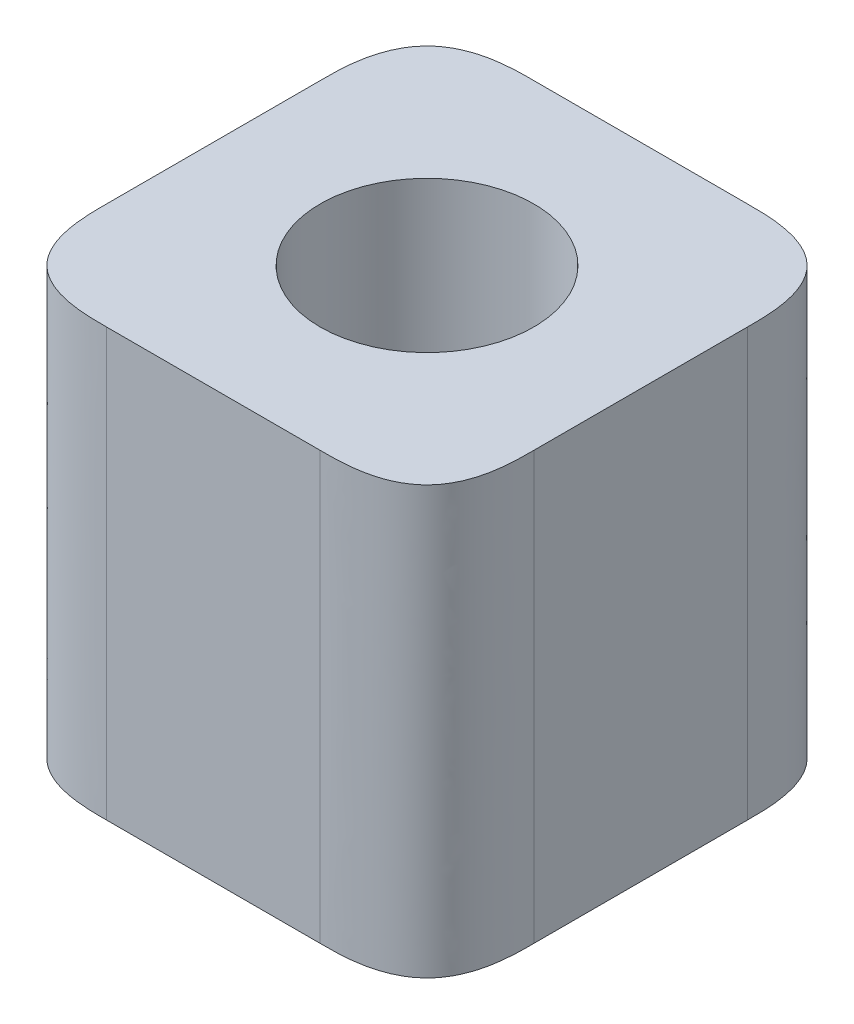
ISO-10303-21;
HEADER;
FILE_DESCRIPTION(('STEP AP214'),'2;1');
FILE_NAME('part.step','',(''),(''),'','','');
FILE_SCHEMA(('AUTOMOTIVE_DESIGN { 1 0 10303 214 1 1 1 1 }'));
ENDSEC;
DATA;
#1=APPLICATION_CONTEXT('core data for automotive mechanical design processes');
#2=APPLICATION_PROTOCOL_DEFINITION('international standard','automotive_design',2000,#1);
#3=PRODUCT_CONTEXT('',#1,'mechanical');
#4=PRODUCT('Part','Part','',(#3));
#5=PRODUCT_RELATED_PRODUCT_CATEGORY('part','',(#4));
#6=PRODUCT_DEFINITION_FORMATION('','',#4);
#7=PRODUCT_DEFINITION_CONTEXT('part definition',#1,'design');
#8=PRODUCT_DEFINITION('design','',#6,#7);
#9=PRODUCT_DEFINITION_SHAPE('','',#8);
#10=(LENGTH_UNIT() NAMED_UNIT(*) SI_UNIT(.MILLI.,.METRE.));
#11=(NAMED_UNIT(*) PLANE_ANGLE_UNIT() SI_UNIT($,.RADIAN.));
#12=(NAMED_UNIT(*) SI_UNIT($,.STERADIAN.) SOLID_ANGLE_UNIT());
#13=UNCERTAINTY_MEASURE_WITH_UNIT(LENGTH_MEASURE(1.E-05),#10,'distance_accuracy_value','');
#14=(GEOMETRIC_REPRESENTATION_CONTEXT(3) GLOBAL_UNCERTAINTY_ASSIGNED_CONTEXT((#13)) GLOBAL_UNIT_ASSIGNED_CONTEXT((#10,
#11,#12)) REPRESENTATION_CONTEXT('',''));
#15=CARTESIAN_POINT('',(0.,0.,0.));
#16=DIRECTION('',(0.,0.,1.));
#17=DIRECTION('',(1.,0.,0.));
#18=AXIS2_PLACEMENT_3D('',#15,#16,#17);
#19=CARTESIAN_POINT('',(0.,7.,0.));
#20=DIRECTION('',(0.,-1.,0.));
#21=DIRECTION('',(0.,0.,-1.));
#22=AXIS2_PLACEMENT_3D('',#19,#20,#21);
#23=PLANE('',#22);
#24=DIRECTION('',(1.,0.,0.));
#25=VECTOR('',#24,1.);
#26=CARTESIAN_POINT('',(-4.,7.,4.));
#27=LINE('',#26,#25);
#28=CARTESIAN_POINT('',(-2.,7.,4.));
#29=VERTEX_POINT('',#28);
#30=CARTESIAN_POINT('',(2.,7.,4.));
#31=VERTEX_POINT('',#30);
#32=EDGE_CURVE('E143',#29,#31,#27,.T.);
#33=ORIENTED_EDGE('',*,*,#32,.T.);
#34=CARTESIAN_POINT('',(4.,6.99999999999957,2.));
#35=CARTESIAN_POINT('',(4.,6.99999999999957,2.33639610306789));
#36=CARTESIAN_POINT('',(4.,6.99999999999957,2.67279220613578));
#37=CARTESIAN_POINT('',(3.85661616032783,7.00000000000068,3.41421356237309));
#38=CARTESIAN_POINT('',(3.41421356237309,7.00000000000068,3.85661616032783));
#39=CARTESIAN_POINT('',(2.67279220613578,6.99999999999957,4.));
#40=CARTESIAN_POINT('',(2.33639610306789,6.99999999999957,4.));
#41=CARTESIAN_POINT('',(2.,6.99999999999957,4.));
#42=B_SPLINE_CURVE_WITH_KNOTS('',5,(#34,#35,#36,#37,#38,#39,#40,#41),.UNSPECIFIED.,.F.,.F.,(6,2,
6),(0.,0.5,1.),.UNSPECIFIED.);
#43=CARTESIAN_POINT('',(4.,7.,2.));
#44=VERTEX_POINT('',#43);
#45=EDGE_CURVE('E224',#31,#44,#42,.F.);
#46=ORIENTED_EDGE('',*,*,#45,.T.);
#47=DIRECTION('',(0.,0.,-1.));
#48=VECTOR('',#47,1.);
#49=CARTESIAN_POINT('',(4.,7.,4.));
#50=LINE('',#49,#48);
#51=CARTESIAN_POINT('',(4.,7.,-2.));
#52=VERTEX_POINT('',#51);
#53=EDGE_CURVE('E267',#44,#52,#50,.T.);
#54=ORIENTED_EDGE('',*,*,#53,.T.);
#55=CARTESIAN_POINT('',(2.,6.99999999999957,-4.));
#56=CARTESIAN_POINT('',(2.33639610306789,6.99999999999957,-4.));
#57=CARTESIAN_POINT('',(2.67279220613578,6.99999999999957,-4.));
#58=CARTESIAN_POINT('',(3.41421356237309,7.00000000000068,-3.85661616032783));
#59=CARTESIAN_POINT('',(3.85661616032783,7.00000000000068,-3.41421356237309));
#60=CARTESIAN_POINT('',(4.,6.99999999999957,-2.67279220613578));
#61=CARTESIAN_POINT('',(4.,6.99999999999957,-2.33639610306789));
#62=CARTESIAN_POINT('',(4.,6.99999999999957,-2.));
#63=B_SPLINE_CURVE_WITH_KNOTS('',5,(#55,#56,#57,#58,#59,#60,#61,#62),.UNSPECIFIED.,.F.,.F.,(6,2,
6),(0.,0.5,1.),.UNSPECIFIED.);
#64=CARTESIAN_POINT('',(2.,7.,-4.));
#65=VERTEX_POINT('',#64);
#66=EDGE_CURVE('E141',#52,#65,#63,.F.);
#67=ORIENTED_EDGE('',*,*,#66,.T.);
#68=DIRECTION('',(-1.,0.,0.));
#69=VECTOR('',#68,1.);
#70=CARTESIAN_POINT('',(-4.,7.,-4.));
#71=LINE('',#70,#69);
#72=CARTESIAN_POINT('',(-2.,7.,-4.));
#73=VERTEX_POINT('',#72);
#74=EDGE_CURVE('E269',#65,#73,#71,.T.);
#75=ORIENTED_EDGE('',*,*,#74,.T.);
#76=CARTESIAN_POINT('',(-4.,6.99999999999957,-2.));
#77=CARTESIAN_POINT('',(-4.,6.99999999999957,-2.33639610306789));
#78=CARTESIAN_POINT('',(-4.,6.99999999999957,-2.67279220613578));
#79=CARTESIAN_POINT('',(-3.85661616032783,7.00000000000068,-3.41421356237309));
#80=CARTESIAN_POINT('',(-3.41421356237309,7.00000000000068,-3.85661616032783));
#81=CARTESIAN_POINT('',(-2.67279220613578,6.99999999999957,-4.));
#82=CARTESIAN_POINT('',(-2.33639610306789,6.99999999999957,-4.));
#83=CARTESIAN_POINT('',(-2.,6.99999999999957,-4.));
#84=B_SPLINE_CURVE_WITH_KNOTS('',5,(#76,#77,#78,#79,#80,#81,#82,#83),.UNSPECIFIED.,.F.,.F.,(6,2,
6),(0.,0.5,1.),.UNSPECIFIED.);
#85=CARTESIAN_POINT('',(-4.,7.,-2.));
#86=VERTEX_POINT('',#85);
#87=EDGE_CURVE('E68',#73,#86,#84,.F.);
#88=ORIENTED_EDGE('',*,*,#87,.T.);
#89=DIRECTION('',(0.,0.,1.));
#90=VECTOR('',#89,1.);
#91=CARTESIAN_POINT('',(-4.,7.,4.));
#92=LINE('',#91,#90);
#93=CARTESIAN_POINT('',(-4.,7.,2.));
#94=VERTEX_POINT('',#93);
#95=EDGE_CURVE('E281',#86,#94,#92,.T.);
#96=ORIENTED_EDGE('',*,*,#95,.T.);
#97=CARTESIAN_POINT('',(-2.,6.99999999999957,4.));
#98=CARTESIAN_POINT('',(-2.33639610306789,6.99999999999957,4.));
#99=CARTESIAN_POINT('',(-2.67279220613578,6.99999999999957,4.));
#100=CARTESIAN_POINT('',(-3.41421356237309,7.00000000000068,3.85661616032783));
#101=CARTESIAN_POINT('',(-3.85661616032783,7.00000000000068,3.41421356237309));
#102=CARTESIAN_POINT('',(-4.,6.99999999999957,2.67279220613578));
#103=CARTESIAN_POINT('',(-4.,6.99999999999957,2.33639610306789));
#104=CARTESIAN_POINT('',(-4.,6.99999999999957,2.));
#105=B_SPLINE_CURVE_WITH_KNOTS('',5,(#97,#98,#99,#100,#101,#102,#103,#104),.UNSPECIFIED.,.F.,
.F.,(6,2,6),(0.,0.5,1.),.UNSPECIFIED.);
#106=EDGE_CURVE('E223',#94,#29,#105,.F.);
#107=ORIENTED_EDGE('',*,*,#106,.T.);
#108=EDGE_LOOP('',(#33,#46,#54,#67,#75,#88,#96,#107));
#109=FACE_BOUND('',#108,.T.);
#110=CARTESIAN_POINT('',(0.,7.,0.));
#111=DIRECTION('',(0.,1.,0.));
#112=DIRECTION('',(0.,0.,1.));
#113=AXIS2_PLACEMENT_3D('',#110,#111,#112);
#114=CIRCLE('',#113,2.);
#115=CARTESIAN_POINT('',(0.,7.,2.));
#116=VERTEX_POINT('',#115);
#117=EDGE_CURVE('E270',#116,#116,#114,.T.);
#118=ORIENTED_EDGE('',*,*,#117,.F.);
#119=EDGE_LOOP('',(#118));
#120=FACE_BOUND('',#119,.T.);
#121=ADVANCED_FACE('F39',(#109,#120),#23,.F.);
#122=CARTESIAN_POINT('',(4.,7.,4.));
#123=DIRECTION('',(-1.,0.,0.));
#124=DIRECTION('',(0.,0.,1.));
#125=AXIS2_PLACEMENT_3D('',#122,#123,#124);
#126=PLANE('',#125);
#127=ORIENTED_EDGE('',*,*,#53,.F.);
#128=CARTESIAN_POINT('',(4.,-1.4,2.));
#129=CARTESIAN_POINT('',(4.,1.53333333333333,2.));
#130=CARTESIAN_POINT('',(4.,4.46666666666635,2.));
#131=CARTESIAN_POINT('',(4.,7.4,2.));
#132=B_SPLINE_CURVE_WITH_KNOTS('',3,(#128,#129,#130,#131),.UNSPECIFIED.,.F.,.F.,(4,4),
(-0.000399999999999999,0.0084),.UNSPECIFIED.);
#133=CARTESIAN_POINT('',(4.,-1.,2.));
#134=VERTEX_POINT('',#133);
#135=EDGE_CURVE('E126',#44,#134,#132,.F.);
#136=ORIENTED_EDGE('',*,*,#135,.T.);
#137=DIRECTION('',(0.,0.,1.));
#138=VECTOR('',#137,1.);
#139=CARTESIAN_POINT('',(4.,-1.,4.));
#140=LINE('',#139,#138);
#141=CARTESIAN_POINT('',(4.,-1.,-2.));
#142=VERTEX_POINT('',#141);
#143=EDGE_CURVE('E117',#142,#134,#140,.T.);
#144=ORIENTED_EDGE('',*,*,#143,.F.);
#145=CARTESIAN_POINT('',(4.,7.4,-2.));
#146=CARTESIAN_POINT('',(4.,4.46666666666635,-2.));
#147=CARTESIAN_POINT('',(4.,1.53333333333333,-2.));
#148=CARTESIAN_POINT('',(4.,-1.4,-2.));
#149=B_SPLINE_CURVE_WITH_KNOTS('',3,(#145,#146,#147,#148),.UNSPECIFIED.,.F.,.F.,(4,4),(-0.0004,
0.0084),.UNSPECIFIED.);
#150=EDGE_CURVE('E133',#142,#52,#149,.F.);
#151=ORIENTED_EDGE('',*,*,#150,.T.);
#152=EDGE_LOOP('',(#127,#136,#144,#151));
#153=FACE_BOUND('',#152,.T.);
#154=ADVANCED_FACE('F132',(#153),#126,.F.);
#155=CARTESIAN_POINT('',(-4.,7.,-4.));
#156=DIRECTION('',(0.,0.,1.));
#157=DIRECTION('',(1.,0.,0.));
#158=AXIS2_PLACEMENT_3D('',#155,#156,#157);
#159=PLANE('',#158);
#160=DIRECTION('',(1.,0.,0.));
#161=VECTOR('',#160,1.);
#162=CARTESIAN_POINT('',(-4.,-1.,-4.));
#163=LINE('',#162,#161);
#164=CARTESIAN_POINT('',(-2.,-1.,-4.));
#165=VERTEX_POINT('',#164);
#166=CARTESIAN_POINT('',(2.,-1.,-4.));
#167=VERTEX_POINT('',#166);
#168=EDGE_CURVE('E119',#165,#167,#163,.T.);
#169=ORIENTED_EDGE('',*,*,#168,.F.);
#170=CARTESIAN_POINT('',(-2.,7.4,-4.));
#171=CARTESIAN_POINT('',(-2.,4.46666666666635,-4.));
#172=CARTESIAN_POINT('',(-2.,1.53333333333333,-4.));
#173=CARTESIAN_POINT('',(-2.,-1.4,-4.));
#174=B_SPLINE_CURVE_WITH_KNOTS('',3,(#170,#171,#172,#173),.UNSPECIFIED.,.F.,.F.,(4,4),(-0.0004,
0.0084),.UNSPECIFIED.);
#175=EDGE_CURVE('E11',#165,#73,#174,.F.);
#176=ORIENTED_EDGE('',*,*,#175,.T.);
#177=ORIENTED_EDGE('',*,*,#74,.F.);
#178=CARTESIAN_POINT('',(2.,-1.4,-4.));
#179=CARTESIAN_POINT('',(2.,1.53333333333333,-4.));
#180=CARTESIAN_POINT('',(2.,4.46666666666635,-4.));
#181=CARTESIAN_POINT('',(2.,7.4,-4.));
#182=B_SPLINE_CURVE_WITH_KNOTS('',3,(#178,#179,#180,#181),.UNSPECIFIED.,.F.,.F.,(4,4),
(-0.000399999999999999,0.0084),.UNSPECIFIED.);
#183=EDGE_CURVE('E53',#65,#167,#182,.F.);
#184=ORIENTED_EDGE('',*,*,#183,.T.);
#185=EDGE_LOOP('',(#169,#176,#177,#184));
#186=FACE_BOUND('',#185,.T.);
#187=ADVANCED_FACE('F248',(#186),#159,.F.);
#188=CARTESIAN_POINT('',(-4.,7.,4.));
#189=DIRECTION('',(1.,0.,0.));
#190=DIRECTION('',(0.,0.,-1.));
#191=AXIS2_PLACEMENT_3D('',#188,#189,#190);
#192=PLANE('',#191);
#193=DIRECTION('',(0.,0.,-1.));
#194=VECTOR('',#193,1.);
#195=CARTESIAN_POINT('',(-4.,-1.,4.));
#196=LINE('',#195,#194);
#197=CARTESIAN_POINT('',(-4.,-1.,2.));
#198=VERTEX_POINT('',#197);
#199=CARTESIAN_POINT('',(-4.,-1.,-2.));
#200=VERTEX_POINT('',#199);
#201=EDGE_CURVE('E245',#198,#200,#196,.T.);
#202=ORIENTED_EDGE('',*,*,#201,.F.);
#203=CARTESIAN_POINT('',(-4.,7.4,2.));
#204=CARTESIAN_POINT('',(-4.,4.46666666666635,2.));
#205=CARTESIAN_POINT('',(-4.,1.53333333333333,2.));
#206=CARTESIAN_POINT('',(-4.,-1.4,2.));
#207=B_SPLINE_CURVE_WITH_KNOTS('',3,(#203,#204,#205,#206),.UNSPECIFIED.,.F.,.F.,(4,4),(-0.0004,
0.0084),.UNSPECIFIED.);
#208=EDGE_CURVE('E60',#198,#94,#207,.F.);
#209=ORIENTED_EDGE('',*,*,#208,.T.);
#210=ORIENTED_EDGE('',*,*,#95,.F.);
#211=CARTESIAN_POINT('',(-4.,-1.4,-2.));
#212=CARTESIAN_POINT('',(-4.,1.53333333333333,-2.));
#213=CARTESIAN_POINT('',(-4.,4.46666666666635,-2.));
#214=CARTESIAN_POINT('',(-4.,7.4,-2.));
#215=B_SPLINE_CURVE_WITH_KNOTS('',3,(#211,#212,#213,#214),.UNSPECIFIED.,.F.,.F.,(4,4),
(-0.000399999999999999,0.0084),.UNSPECIFIED.);
#216=EDGE_CURVE('E222',#86,#200,#215,.F.);
#217=ORIENTED_EDGE('',*,*,#216,.T.);
#218=EDGE_LOOP('',(#202,#209,#210,#217));
#219=FACE_BOUND('',#218,.T.);
#220=ADVANCED_FACE('F332',(#219),#192,.F.);
#221=CARTESIAN_POINT('',(-4.,7.,4.));
#222=DIRECTION('',(0.,0.,-1.));
#223=DIRECTION('',(-1.,0.,0.));
#224=AXIS2_PLACEMENT_3D('',#221,#222,#223);
#225=PLANE('',#224);
#226=DIRECTION('',(-1.,0.,0.));
#227=VECTOR('',#226,1.);
#228=CARTESIAN_POINT('',(-4.,-1.,4.));
#229=LINE('',#228,#227);
#230=CARTESIAN_POINT('',(2.,-1.,4.));
#231=VERTEX_POINT('',#230);
#232=CARTESIAN_POINT('',(-2.,-1.,4.));
#233=VERTEX_POINT('',#232);
#234=EDGE_CURVE('E138',#231,#233,#229,.T.);
#235=ORIENTED_EDGE('',*,*,#234,.F.);
#236=CARTESIAN_POINT('',(2.,7.4,4.));
#237=CARTESIAN_POINT('',(2.,4.46666666666635,4.));
#238=CARTESIAN_POINT('',(2.,1.53333333333333,4.));
#239=CARTESIAN_POINT('',(2.,-1.4,4.));
#240=B_SPLINE_CURVE_WITH_KNOTS('',3,(#236,#237,#238,#239),.UNSPECIFIED.,.F.,.F.,(4,4),(-0.0004,
0.0084),.UNSPECIFIED.);
#241=EDGE_CURVE('E225',#231,#31,#240,.F.);
#242=ORIENTED_EDGE('',*,*,#241,.T.);
#243=ORIENTED_EDGE('',*,*,#32,.F.);
#244=CARTESIAN_POINT('',(-2.,-1.4,4.));
#245=CARTESIAN_POINT('',(-2.,1.53333333333333,4.));
#246=CARTESIAN_POINT('',(-2.,4.46666666666635,4.));
#247=CARTESIAN_POINT('',(-2.,7.4,4.));
#248=B_SPLINE_CURVE_WITH_KNOTS('',3,(#244,#245,#246,#247),.UNSPECIFIED.,.F.,.F.,(4,4),
(-0.000399999999999999,0.0084),.UNSPECIFIED.);
#249=EDGE_CURVE('E228',#29,#233,#248,.F.);
#250=ORIENTED_EDGE('',*,*,#249,.T.);
#251=EDGE_LOOP('',(#235,#242,#243,#250));
#252=FACE_BOUND('',#251,.T.);
#253=ADVANCED_FACE('F300',(#252),#225,.F.);
#254=CARTESIAN_POINT('',(0.,7.,0.));
#255=DIRECTION('',(0.,-1.,0.));
#256=DIRECTION('',(0.,0.,-1.));
#257=AXIS2_PLACEMENT_3D('',#254,#255,#256);
#258=CYLINDRICAL_SURFACE('',#257,2.);
#259=ORIENTED_EDGE('',*,*,#117,.T.);
#260=EDGE_LOOP('',(#259));
#261=FACE_BOUND('',#260,.T.);
#262=CARTESIAN_POINT('',(0.,0.,0.));
#263=DIRECTION('',(0.,1.,0.));
#264=DIRECTION('',(0.,0.,1.));
#265=AXIS2_PLACEMENT_3D('',#262,#263,#264);
#266=CIRCLE('',#265,2.);
#267=CARTESIAN_POINT('',(0.,0.,2.));
#268=VERTEX_POINT('',#267);
#269=EDGE_CURVE('E275',#268,#268,#266,.T.);
#270=ORIENTED_EDGE('',*,*,#269,.F.);
#271=EDGE_LOOP('',(#270));
#272=FACE_BOUND('',#271,.T.);
#273=ADVANCED_FACE('F298',(#261,#272),#258,.F.);
#274=CARTESIAN_POINT('',(0.,0.,0.));
#275=DIRECTION('',(0.,-1.,0.));
#276=DIRECTION('',(0.,0.,-1.));
#277=AXIS2_PLACEMENT_3D('',#274,#275,#276);
#278=PLANE('',#277);
#279=ORIENTED_EDGE('',*,*,#269,.T.);
#280=EDGE_LOOP('',(#279));
#281=FACE_BOUND('',#280,.T.);
#282=ADVANCED_FACE('F495',(#281),#278,.F.);
#283=CARTESIAN_POINT('',(0.,-1.,0.));
#284=DIRECTION('',(0.,-1.,0.));
#285=DIRECTION('',(0.,0.,-1.));
#286=AXIS2_PLACEMENT_3D('',#283,#284,#285);
#287=PLANE('',#286);
#288=ORIENTED_EDGE('',*,*,#143,.T.);
#289=CARTESIAN_POINT('',(2.,-1.00000000000002,4.));
#290=CARTESIAN_POINT('',(2.33639610306789,-1.00000000000002,4.));
#291=CARTESIAN_POINT('',(2.67279220613578,-1.00000000000002,4.));
#292=CARTESIAN_POINT('',(3.4142135623731,-0.999999999999968,3.85661616032783));
#293=CARTESIAN_POINT('',(3.85661616032783,-0.999999999999968,3.4142135623731));
#294=CARTESIAN_POINT('',(4.,-1.00000000000002,2.67279220613578));
#295=CARTESIAN_POINT('',(4.,-1.00000000000002,2.33639610306789));
#296=CARTESIAN_POINT('',(4.,-1.00000000000002,2.));
#297=B_SPLINE_CURVE_WITH_KNOTS('',5,(#289,#290,#291,#292,#293,#294,#295,#296),.UNSPECIFIED.,.F.,
.F.,(6,2,6),(0.,0.5,1.),.UNSPECIFIED.);
#298=EDGE_CURVE('E236',#134,#231,#297,.F.);
#299=ORIENTED_EDGE('',*,*,#298,.T.);
#300=ORIENTED_EDGE('',*,*,#234,.T.);
#301=CARTESIAN_POINT('',(-4.,-1.00000000000002,2.));
#302=CARTESIAN_POINT('',(-4.,-1.00000000000002,2.33639610306789));
#303=CARTESIAN_POINT('',(-4.,-1.00000000000002,2.67279220613578));
#304=CARTESIAN_POINT('',(-3.85661616032783,-0.999999999999968,3.4142135623731));
#305=CARTESIAN_POINT('',(-3.4142135623731,-0.999999999999968,3.85661616032783));
#306=CARTESIAN_POINT('',(-2.67279220613578,-1.00000000000002,4.));
#307=CARTESIAN_POINT('',(-2.33639610306789,-1.00000000000002,4.));
#308=CARTESIAN_POINT('',(-2.,-1.00000000000002,4.));
#309=B_SPLINE_CURVE_WITH_KNOTS('',5,(#301,#302,#303,#304,#305,#306,#307,#308),.UNSPECIFIED.,.F.,
.F.,(6,2,6),(0.,0.5,1.),.UNSPECIFIED.);
#310=EDGE_CURVE('E240',#233,#198,#309,.F.);
#311=ORIENTED_EDGE('',*,*,#310,.T.);
#312=ORIENTED_EDGE('',*,*,#201,.T.);
#313=CARTESIAN_POINT('',(-2.,-1.00000000000002,-4.));
#314=CARTESIAN_POINT('',(-2.33639610306789,-1.00000000000002,-4.));
#315=CARTESIAN_POINT('',(-2.67279220613578,-1.00000000000002,-4.));
#316=CARTESIAN_POINT('',(-3.4142135623731,-0.999999999999968,-3.85661616032783));
#317=CARTESIAN_POINT('',(-3.85661616032783,-0.999999999999968,-3.4142135623731));
#318=CARTESIAN_POINT('',(-4.,-1.00000000000002,-2.67279220613578));
#319=CARTESIAN_POINT('',(-4.,-1.00000000000002,-2.33639610306789));
#320=CARTESIAN_POINT('',(-4.,-1.00000000000002,-2.));
#321=B_SPLINE_CURVE_WITH_KNOTS('',5,(#313,#314,#315,#316,#317,#318,#319,#320),.UNSPECIFIED.,.F.,
.F.,(6,2,6),(0.,0.5,1.),.UNSPECIFIED.);
#322=EDGE_CURVE('E125',#200,#165,#321,.F.);
#323=ORIENTED_EDGE('',*,*,#322,.T.);
#324=ORIENTED_EDGE('',*,*,#168,.T.);
#325=CARTESIAN_POINT('',(4.,-1.00000000000002,-2.));
#326=CARTESIAN_POINT('',(4.,-1.00000000000002,-2.33639610306789));
#327=CARTESIAN_POINT('',(4.,-1.00000000000002,-2.67279220613578));
#328=CARTESIAN_POINT('',(3.85661616032783,-0.999999999999968,-3.4142135623731));
#329=CARTESIAN_POINT('',(3.4142135623731,-0.999999999999968,-3.85661616032783));
#330=CARTESIAN_POINT('',(2.67279220613578,-1.00000000000002,-4.));
#331=CARTESIAN_POINT('',(2.33639610306789,-1.00000000000002,-4.));
#332=CARTESIAN_POINT('',(2.,-1.00000000000002,-4.));
#333=B_SPLINE_CURVE_WITH_KNOTS('',5,(#325,#326,#327,#328,#329,#330,#331,#332),.UNSPECIFIED.,.F.,
.F.,(6,2,6),(0.,0.5,1.),.UNSPECIFIED.);
#334=EDGE_CURVE('E113',#167,#142,#333,.F.);
#335=ORIENTED_EDGE('',*,*,#334,.T.);
#336=EDGE_LOOP('',(#288,#299,#300,#311,#312,#323,#324,#335));
#337=FACE_BOUND('',#336,.T.);
#338=ADVANCED_FACE('F116',(#337),#287,.T.);
#339=CARTESIAN_POINT('',(4.,7.4,2.));
#340=CARTESIAN_POINT('',(4.,4.46666666666635,2.));
#341=CARTESIAN_POINT('',(4.,1.53333333333333,2.));
#342=CARTESIAN_POINT('',(4.,-1.4,2.));
#343=CARTESIAN_POINT('',(4.,7.4,2.33639610306789));
#344=CARTESIAN_POINT('',(4.,4.46666666666635,2.33639610306789));
#345=CARTESIAN_POINT('',(4.,1.53333333333333,2.33639610306789));
#346=CARTESIAN_POINT('',(4.,-1.4,2.33639610306789));
#347=CARTESIAN_POINT('',(4.,7.4,2.67279220613578));
#348=CARTESIAN_POINT('',(4.,4.46666666666635,2.67279220613578));
#349=CARTESIAN_POINT('',(4.,1.53333333333333,2.67279220613578));
#350=CARTESIAN_POINT('',(4.,-1.4,2.67279220613578));
#351=CARTESIAN_POINT('',(3.85661616032783,7.4,3.4142135623731));
#352=CARTESIAN_POINT('',(3.85661616032783,4.46666666667525,3.41421356237309));
#353=CARTESIAN_POINT('',(3.85661616032783,1.53333333333333,3.41421356237309));
#354=CARTESIAN_POINT('',(3.85661616032783,-1.4,3.4142135623731));
#355=CARTESIAN_POINT('',(3.4142135623731,7.4,3.85661616032783));
#356=CARTESIAN_POINT('',(3.41421356237309,4.46666666667525,3.85661616032783));
#357=CARTESIAN_POINT('',(3.41421356237309,1.53333333333333,3.85661616032783));
#358=CARTESIAN_POINT('',(3.4142135623731,-1.4,3.85661616032783));
#359=CARTESIAN_POINT('',(2.67279220613578,7.4,4.));
#360=CARTESIAN_POINT('',(2.67279220613578,4.46666666666635,4.));
#361=CARTESIAN_POINT('',(2.67279220613578,1.53333333333333,4.));
#362=CARTESIAN_POINT('',(2.67279220613578,-1.4,4.));
#363=CARTESIAN_POINT('',(2.33639610306789,7.4,4.));
#364=CARTESIAN_POINT('',(2.33639610306789,4.46666666666635,4.));
#365=CARTESIAN_POINT('',(2.33639610306789,1.53333333333333,4.));
#366=CARTESIAN_POINT('',(2.33639610306789,-1.4,4.));
#367=CARTESIAN_POINT('',(2.,7.4,4.));
#368=CARTESIAN_POINT('',(2.,4.46666666666635,4.));
#369=CARTESIAN_POINT('',(2.,1.53333333333333,4.));
#370=CARTESIAN_POINT('',(2.,-1.4,4.));
#371=B_SPLINE_SURFACE_WITH_KNOTS('',5,3,((#339,#340,#341,#342),(#343,#344,#345,#346),(#347,#348,
#349,#350),(#351,#352,#353,#354),(#355,#356,#357,#358),(#359,#360,#361,#362),(#363,#364,#365,
#366),(#367,#368,#369,#370)),.UNSPECIFIED.,.F.,.F.,.F.,(6,2,6),(4,4),(0.,0.5,1.),(-0.0004,
0.0084),.UNSPECIFIED.);
#372=ORIENTED_EDGE('',*,*,#45,.F.);
#373=ORIENTED_EDGE('',*,*,#241,.F.);
#374=ORIENTED_EDGE('',*,*,#298,.F.);
#375=ORIENTED_EDGE('',*,*,#135,.F.);
#376=EDGE_LOOP('',(#372,#373,#374,#375));
#377=FACE_BOUND('',#376,.T.);
#378=ADVANCED_FACE('F375',(#377),#371,.T.);
#379=CARTESIAN_POINT('',(-2.,7.4,4.));
#380=CARTESIAN_POINT('',(-2.,4.46666666666635,4.));
#381=CARTESIAN_POINT('',(-2.,1.53333333333333,4.));
#382=CARTESIAN_POINT('',(-2.,-1.4,4.));
#383=CARTESIAN_POINT('',(-2.33639610306789,7.4,4.));
#384=CARTESIAN_POINT('',(-2.33639610306789,4.46666666666635,4.));
#385=CARTESIAN_POINT('',(-2.33639610306789,1.53333333333333,4.));
#386=CARTESIAN_POINT('',(-2.33639610306789,-1.4,4.));
#387=CARTESIAN_POINT('',(-2.67279220613578,7.4,4.));
#388=CARTESIAN_POINT('',(-2.67279220613578,4.46666666666635,4.));
#389=CARTESIAN_POINT('',(-2.67279220613578,1.53333333333333,4.));
#390=CARTESIAN_POINT('',(-2.67279220613578,-1.4,4.));
#391=CARTESIAN_POINT('',(-3.4142135623731,7.4,3.85661616032783));
#392=CARTESIAN_POINT('',(-3.41421356237309,4.46666666667525,3.85661616032783));
#393=CARTESIAN_POINT('',(-3.41421356237309,1.53333333333333,3.85661616032783));
#394=CARTESIAN_POINT('',(-3.4142135623731,-1.4,3.85661616032783));
#395=CARTESIAN_POINT('',(-3.85661616032783,7.4,3.4142135623731));
#396=CARTESIAN_POINT('',(-3.85661616032783,4.46666666667525,3.41421356237309));
#397=CARTESIAN_POINT('',(-3.85661616032783,1.53333333333333,3.41421356237309));
#398=CARTESIAN_POINT('',(-3.85661616032783,-1.4,3.4142135623731));
#399=CARTESIAN_POINT('',(-4.,7.4,2.67279220613578));
#400=CARTESIAN_POINT('',(-4.,4.46666666666635,2.67279220613578));
#401=CARTESIAN_POINT('',(-4.,1.53333333333333,2.67279220613578));
#402=CARTESIAN_POINT('',(-4.,-1.4,2.67279220613578));
#403=CARTESIAN_POINT('',(-4.,7.4,2.33639610306789));
#404=CARTESIAN_POINT('',(-4.,4.46666666666635,2.33639610306789));
#405=CARTESIAN_POINT('',(-4.,1.53333333333333,2.33639610306789));
#406=CARTESIAN_POINT('',(-4.,-1.4,2.33639610306789));
#407=CARTESIAN_POINT('',(-4.,7.4,2.));
#408=CARTESIAN_POINT('',(-4.,4.46666666666635,2.));
#409=CARTESIAN_POINT('',(-4.,1.53333333333333,2.));
#410=CARTESIAN_POINT('',(-4.,-1.4,2.));
#411=B_SPLINE_SURFACE_WITH_KNOTS('',5,3,((#379,#380,#381,#382),(#383,#384,#385,#386),(#387,#388,
#389,#390),(#391,#392,#393,#394),(#395,#396,#397,#398),(#399,#400,#401,#402),(#403,#404,#405,
#406),(#407,#408,#409,#410)),.UNSPECIFIED.,.F.,.F.,.F.,(6,2,6),(4,4),(0.,0.5,1.),(-0.0004,
0.0084),.UNSPECIFIED.);
#412=ORIENTED_EDGE('',*,*,#106,.F.);
#413=ORIENTED_EDGE('',*,*,#208,.F.);
#414=ORIENTED_EDGE('',*,*,#310,.F.);
#415=ORIENTED_EDGE('',*,*,#249,.F.);
#416=EDGE_LOOP('',(#412,#413,#414,#415));
#417=FACE_BOUND('',#416,.T.);
#418=ADVANCED_FACE('F190',(#417),#411,.T.);
#419=CARTESIAN_POINT('',(-4.,7.4,-2.));
#420=CARTESIAN_POINT('',(-4.,4.46666666666635,-2.));
#421=CARTESIAN_POINT('',(-4.,1.53333333333333,-2.));
#422=CARTESIAN_POINT('',(-4.,-1.4,-2.));
#423=CARTESIAN_POINT('',(-4.,7.4,-2.33639610306789));
#424=CARTESIAN_POINT('',(-4.,4.46666666666635,-2.33639610306789));
#425=CARTESIAN_POINT('',(-4.,1.53333333333333,-2.33639610306789));
#426=CARTESIAN_POINT('',(-4.,-1.4,-2.33639610306789));
#427=CARTESIAN_POINT('',(-4.,7.4,-2.67279220613578));
#428=CARTESIAN_POINT('',(-4.,4.46666666666635,-2.67279220613578));
#429=CARTESIAN_POINT('',(-4.,1.53333333333333,-2.67279220613578));
#430=CARTESIAN_POINT('',(-4.,-1.4,-2.67279220613578));
#431=CARTESIAN_POINT('',(-3.85661616032783,7.4,-3.4142135623731));
#432=CARTESIAN_POINT('',(-3.85661616032783,4.46666666667525,-3.41421356237309));
#433=CARTESIAN_POINT('',(-3.85661616032783,1.53333333333333,-3.41421356237309));
#434=CARTESIAN_POINT('',(-3.85661616032783,-1.4,-3.4142135623731));
#435=CARTESIAN_POINT('',(-3.4142135623731,7.4,-3.85661616032783));
#436=CARTESIAN_POINT('',(-3.41421356237309,4.46666666667525,-3.85661616032783));
#437=CARTESIAN_POINT('',(-3.41421356237309,1.53333333333333,-3.85661616032783));
#438=CARTESIAN_POINT('',(-3.4142135623731,-1.4,-3.85661616032783));
#439=CARTESIAN_POINT('',(-2.67279220613578,7.4,-4.));
#440=CARTESIAN_POINT('',(-2.67279220613578,4.46666666666635,-4.));
#441=CARTESIAN_POINT('',(-2.67279220613578,1.53333333333333,-4.));
#442=CARTESIAN_POINT('',(-2.67279220613578,-1.4,-4.));
#443=CARTESIAN_POINT('',(-2.33639610306789,7.4,-4.));
#444=CARTESIAN_POINT('',(-2.33639610306789,4.46666666666635,-4.));
#445=CARTESIAN_POINT('',(-2.33639610306789,1.53333333333333,-4.));
#446=CARTESIAN_POINT('',(-2.33639610306789,-1.4,-4.));
#447=CARTESIAN_POINT('',(-2.,7.4,-4.));
#448=CARTESIAN_POINT('',(-2.,4.46666666666635,-4.));
#449=CARTESIAN_POINT('',(-2.,1.53333333333333,-4.));
#450=CARTESIAN_POINT('',(-2.,-1.4,-4.));
#451=B_SPLINE_SURFACE_WITH_KNOTS('',5,3,((#419,#420,#421,#422),(#423,#424,#425,#426),(#427,#428,
#429,#430),(#431,#432,#433,#434),(#435,#436,#437,#438),(#439,#440,#441,#442),(#443,#444,#445,
#446),(#447,#448,#449,#450)),.UNSPECIFIED.,.F.,.F.,.F.,(6,2,6),(4,4),(0.,0.5,1.),(-0.0004,
0.0084),.UNSPECIFIED.);
#452=ORIENTED_EDGE('',*,*,#87,.F.);
#453=ORIENTED_EDGE('',*,*,#175,.F.);
#454=ORIENTED_EDGE('',*,*,#322,.F.);
#455=ORIENTED_EDGE('',*,*,#216,.F.);
#456=EDGE_LOOP('',(#452,#453,#454,#455));
#457=FACE_BOUND('',#456,.T.);
#458=ADVANCED_FACE('F176',(#457),#451,.T.);
#459=CARTESIAN_POINT('',(2.,7.4,-4.));
#460=CARTESIAN_POINT('',(2.,4.46666666666635,-4.));
#461=CARTESIAN_POINT('',(2.,1.53333333333333,-4.));
#462=CARTESIAN_POINT('',(2.,-1.4,-4.));
#463=CARTESIAN_POINT('',(2.33639610306789,7.4,-4.));
#464=CARTESIAN_POINT('',(2.33639610306789,4.46666666666635,-4.));
#465=CARTESIAN_POINT('',(2.33639610306789,1.53333333333333,-4.));
#466=CARTESIAN_POINT('',(2.33639610306789,-1.4,-4.));
#467=CARTESIAN_POINT('',(2.67279220613578,7.4,-4.));
#468=CARTESIAN_POINT('',(2.67279220613578,4.46666666666635,-4.));
#469=CARTESIAN_POINT('',(2.67279220613578,1.53333333333333,-4.));
#470=CARTESIAN_POINT('',(2.67279220613578,-1.4,-4.));
#471=CARTESIAN_POINT('',(3.4142135623731,7.4,-3.85661616032783));
#472=CARTESIAN_POINT('',(3.41421356237309,4.46666666667525,-3.85661616032783));
#473=CARTESIAN_POINT('',(3.41421356237309,1.53333333333333,-3.85661616032783));
#474=CARTESIAN_POINT('',(3.4142135623731,-1.4,-3.85661616032783));
#475=CARTESIAN_POINT('',(3.85661616032783,7.4,-3.4142135623731));
#476=CARTESIAN_POINT('',(3.85661616032783,4.46666666667525,-3.41421356237309));
#477=CARTESIAN_POINT('',(3.85661616032783,1.53333333333333,-3.41421356237309));
#478=CARTESIAN_POINT('',(3.85661616032783,-1.4,-3.4142135623731));
#479=CARTESIAN_POINT('',(4.,7.4,-2.67279220613578));
#480=CARTESIAN_POINT('',(4.,4.46666666666635,-2.67279220613578));
#481=CARTESIAN_POINT('',(4.,1.53333333333333,-2.67279220613578));
#482=CARTESIAN_POINT('',(4.,-1.4,-2.67279220613578));
#483=CARTESIAN_POINT('',(4.,7.4,-2.33639610306789));
#484=CARTESIAN_POINT('',(4.,4.46666666666635,-2.33639610306789));
#485=CARTESIAN_POINT('',(4.,1.53333333333333,-2.33639610306789));
#486=CARTESIAN_POINT('',(4.,-1.4,-2.33639610306789));
#487=CARTESIAN_POINT('',(4.,7.4,-2.));
#488=CARTESIAN_POINT('',(4.,4.46666666666635,-2.));
#489=CARTESIAN_POINT('',(4.,1.53333333333333,-2.));
#490=CARTESIAN_POINT('',(4.,-1.4,-2.));
#491=B_SPLINE_SURFACE_WITH_KNOTS('',5,3,((#459,#460,#461,#462),(#463,#464,#465,#466),(#467,#468,
#469,#470),(#471,#472,#473,#474),(#475,#476,#477,#478),(#479,#480,#481,#482),(#483,#484,#485,
#486),(#487,#488,#489,#490)),.UNSPECIFIED.,.F.,.F.,.F.,(6,2,6),(4,4),(0.,0.5,1.),(-0.0004,
0.0084),.UNSPECIFIED.);
#492=ORIENTED_EDGE('',*,*,#66,.F.);
#493=ORIENTED_EDGE('',*,*,#150,.F.);
#494=ORIENTED_EDGE('',*,*,#334,.F.);
#495=ORIENTED_EDGE('',*,*,#183,.F.);
#496=EDGE_LOOP('',(#492,#493,#494,#495));
#497=FACE_BOUND('',#496,.T.);
#498=ADVANCED_FACE('F42',(#497),#491,.T.);
#499=CLOSED_SHELL('',(#121,#154,#187,#220,#253,#273,#282,#338,#378,#418,#458,#498));
#500=MANIFOLD_SOLID_BREP('B2',#499);
#501=ADVANCED_BREP_SHAPE_REPRESENTATION('',(#18,#500),#14);
#502=SHAPE_DEFINITION_REPRESENTATION(#9,#501);
ENDSEC;
END-ISO-10303-21;
